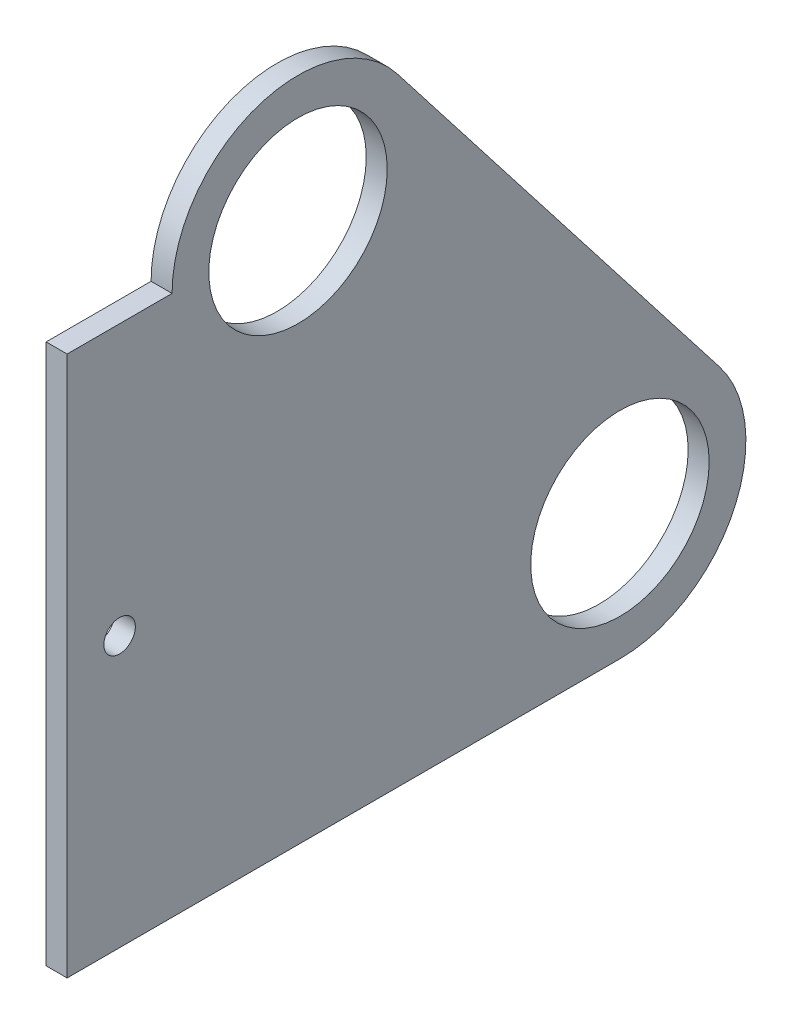
ISO-10303-21;
HEADER;
FILE_DESCRIPTION(('STEP AP214'),'2;1');
FILE_NAME('part.step','',(''),(''),'','','');
FILE_SCHEMA(('AUTOMOTIVE_DESIGN { 1 0 10303 214 1 1 1 1 }'));
ENDSEC;
DATA;
#1=APPLICATION_CONTEXT('core data for automotive mechanical design processes');
#2=APPLICATION_PROTOCOL_DEFINITION('international standard','automotive_design',2000,#1);
#3=PRODUCT_CONTEXT('',#1,'mechanical');
#4=PRODUCT('Part','Part','',(#3));
#5=PRODUCT_RELATED_PRODUCT_CATEGORY('part','',(#4));
#6=PRODUCT_DEFINITION_FORMATION('','',#4);
#7=PRODUCT_DEFINITION_CONTEXT('part definition',#1,'design');
#8=PRODUCT_DEFINITION('design','',#6,#7);
#9=PRODUCT_DEFINITION_SHAPE('','',#8);
#10=(LENGTH_UNIT() NAMED_UNIT(*) SI_UNIT(.MILLI.,.METRE.));
#11=(NAMED_UNIT(*) PLANE_ANGLE_UNIT() SI_UNIT($,.RADIAN.));
#12=(NAMED_UNIT(*) SI_UNIT($,.STERADIAN.) SOLID_ANGLE_UNIT());
#13=UNCERTAINTY_MEASURE_WITH_UNIT(LENGTH_MEASURE(1.E-05),#10,'distance_accuracy_value','');
#14=(GEOMETRIC_REPRESENTATION_CONTEXT(3) GLOBAL_UNCERTAINTY_ASSIGNED_CONTEXT((#13)) GLOBAL_UNIT_ASSIGNED_CONTEXT((#10,
#11,#12)) REPRESENTATION_CONTEXT('',''));
#15=CARTESIAN_POINT('',(0.,0.,0.));
#16=DIRECTION('',(0.,0.,1.));
#17=DIRECTION('',(1.,0.,0.));
#18=AXIS2_PLACEMENT_3D('',#15,#16,#17);
#19=CARTESIAN_POINT('',(2.,0.,0.));
#20=DIRECTION('',(-1.,0.,0.));
#21=DIRECTION('',(0.,0.,1.));
#22=AXIS2_PLACEMENT_3D('',#19,#20,#21);
#23=CYLINDRICAL_SURFACE('',#22,12.);
#24=CARTESIAN_POINT('',(0.,0.,0.));
#25=DIRECTION('',(1.,0.,0.));
#26=DIRECTION('',(0.,0.,-1.));
#27=AXIS2_PLACEMENT_3D('',#24,#25,#26);
#28=CIRCLE('',#27,12.);
#29=CARTESIAN_POINT('',(0.,7.36150243810954,-9.47672316012804));
#30=VERTEX_POINT('',#29);
#31=CARTESIAN_POINT('',(0.,-12.,0.));
#32=VERTEX_POINT('',#31);
#33=EDGE_CURVE('E127',#30,#32,#28,.F.);
#34=ORIENTED_EDGE('',*,*,#33,.F.);
#35=DIRECTION('',(-1.,0.,0.));
#36=VECTOR('',#35,1.);
#37=CARTESIAN_POINT('',(2.,7.36150243810954,-9.47672316012804));
#38=LINE('',#37,#36);
#39=CARTESIAN_POINT('',(2.,7.36150243810954,-9.47672316012804));
#40=VERTEX_POINT('',#39);
#41=EDGE_CURVE('E11',#40,#30,#38,.T.);
#42=ORIENTED_EDGE('',*,*,#41,.F.);
#43=CARTESIAN_POINT('',(2.,0.,0.));
#44=DIRECTION('',(1.,0.,0.));
#45=DIRECTION('',(0.,0.,-1.));
#46=AXIS2_PLACEMENT_3D('',#43,#44,#45);
#47=CIRCLE('',#46,12.);
#48=CARTESIAN_POINT('',(2.,-12.,0.));
#49=VERTEX_POINT('',#48);
#50=EDGE_CURVE('E146',#40,#49,#47,.F.);
#51=ORIENTED_EDGE('',*,*,#50,.T.);
#52=DIRECTION('',(-1.,0.,0.));
#53=VECTOR('',#52,1.);
#54=CARTESIAN_POINT('',(2.,-12.,0.));
#55=LINE('',#54,#53);
#56=EDGE_CURVE('E85',#49,#32,#55,.T.);
#57=ORIENTED_EDGE('',*,*,#56,.T.);
#58=EDGE_LOOP('',(#34,#42,#51,#57));
#59=FACE_BOUND('',#58,.T.);
#60=ADVANCED_FACE('F39',(#59),#23,.T.);
#61=CARTESIAN_POINT('',(2.,7.36150243810954,-9.47672316012804));
#62=DIRECTION('',(0.,0.613458536509128,-0.78972693001067));
#63=DIRECTION('',(0.,0.78972693001067,0.613458536509128));
#64=AXIS2_PLACEMENT_3D('',#61,#62,#63);
#65=PLANE('',#64);
#66=DIRECTION('',(0.,-0.78972693001067,-0.613458536509128));
#67=VECTOR('',#66,1.);
#68=CARTESIAN_POINT('',(0.,7.36150243810954,-9.47672316012804));
#69=LINE('',#68,#67);
#70=CARTESIAN_POINT('',(0.,46.8478489386431,21.1962036653284));
#71=VERTEX_POINT('',#70);
#72=EDGE_CURVE('E130',#71,#30,#69,.T.);
#73=ORIENTED_EDGE('',*,*,#72,.F.);
#74=DIRECTION('',(-1.,0.,0.));
#75=VECTOR('',#74,1.);
#76=CARTESIAN_POINT('',(2.,46.8478489386431,21.1962036653284));
#77=LINE('',#76,#75);
#78=CARTESIAN_POINT('',(2.,46.8478489386431,21.1962036653284));
#79=VERTEX_POINT('',#78);
#80=EDGE_CURVE('E48',#79,#71,#77,.T.);
#81=ORIENTED_EDGE('',*,*,#80,.F.);
#82=DIRECTION('',(0.,-0.78972693001067,-0.613458536509128));
#83=VECTOR('',#82,1.);
#84=CARTESIAN_POINT('',(2.,7.36150243810954,-9.47672316012804));
#85=LINE('',#84,#83);
#86=EDGE_CURVE('E163',#79,#40,#85,.T.);
#87=ORIENTED_EDGE('',*,*,#86,.T.);
#88=ORIENTED_EDGE('',*,*,#41,.T.);
#89=EDGE_LOOP('',(#73,#81,#87,#88));
#90=FACE_BOUND('',#89,.T.);
#91=ADVANCED_FACE('F156',(#90),#65,.T.);
#92=CARTESIAN_POINT('',(2.,39.4863465005335,30.6729268254564));
#93=DIRECTION('',(-1.,0.,0.));
#94=DIRECTION('',(0.,0.,1.));
#95=AXIS2_PLACEMENT_3D('',#92,#93,#94);
#96=CYLINDRICAL_SURFACE('',#95,12.);
#97=CARTESIAN_POINT('',(0.,39.4863465005335,30.6729268254564));
#98=DIRECTION('',(1.,0.,0.));
#99=DIRECTION('',(0.,0.,-1.));
#100=AXIS2_PLACEMENT_3D('',#97,#98,#99);
#101=CIRCLE('',#100,12.);
#102=CARTESIAN_POINT('',(0.,39.4863465005335,42.6729268254564));
#103=VERTEX_POINT('',#102);
#104=EDGE_CURVE('E133',#103,#71,#101,.F.);
#105=ORIENTED_EDGE('',*,*,#104,.F.);
#106=DIRECTION('',(-1.,0.,0.));
#107=VECTOR('',#106,1.);
#108=CARTESIAN_POINT('',(2.,39.4863465005335,42.6729268254564));
#109=LINE('',#108,#107);
#110=CARTESIAN_POINT('',(2.,39.4863465005335,42.6729268254564));
#111=VERTEX_POINT('',#110);
#112=EDGE_CURVE('E113',#111,#103,#109,.T.);
#113=ORIENTED_EDGE('',*,*,#112,.F.);
#114=CARTESIAN_POINT('',(2.,39.4863465005335,30.6729268254564));
#115=DIRECTION('',(1.,0.,0.));
#116=DIRECTION('',(0.,0.,-1.));
#117=AXIS2_PLACEMENT_3D('',#114,#115,#116);
#118=CIRCLE('',#117,12.);
#119=EDGE_CURVE('E106',#111,#79,#118,.F.);
#120=ORIENTED_EDGE('',*,*,#119,.T.);
#121=ORIENTED_EDGE('',*,*,#80,.T.);
#122=EDGE_LOOP('',(#105,#113,#120,#121));
#123=FACE_BOUND('',#122,.T.);
#124=ADVANCED_FACE('F153',(#123),#96,.T.);
#125=CARTESIAN_POINT('',(2.,39.4863465005335,0.));
#126=DIRECTION('',(0.,-1.,0.));
#127=DIRECTION('',(0.,0.,-1.));
#128=AXIS2_PLACEMENT_3D('',#125,#126,#127);
#129=PLANE('',#128);
#130=DIRECTION('',(0.,0.,1.));
#131=VECTOR('',#130,1.);
#132=CARTESIAN_POINT('',(0.,39.4863465005335,0.));
#133=LINE('',#132,#131);
#134=CARTESIAN_POINT('',(0.,39.4863465005335,52.6729268254564));
#135=VERTEX_POINT('',#134);
#136=EDGE_CURVE('E112',#103,#135,#133,.T.);
#137=ORIENTED_EDGE('',*,*,#136,.T.);
#138=DIRECTION('',(-1.,0.,0.));
#139=VECTOR('',#138,1.);
#140=CARTESIAN_POINT('',(2.,39.4863465005335,52.6729268254564));
#141=LINE('',#140,#139);
#142=CARTESIAN_POINT('',(2.,39.4863465005335,52.6729268254564));
#143=VERTEX_POINT('',#142);
#144=EDGE_CURVE('E109',#143,#135,#141,.T.);
#145=ORIENTED_EDGE('',*,*,#144,.F.);
#146=DIRECTION('',(0.,0.,1.));
#147=VECTOR('',#146,1.);
#148=CARTESIAN_POINT('',(2.,39.4863465005335,0.));
#149=LINE('',#148,#147);
#150=EDGE_CURVE('E98',#111,#143,#149,.T.);
#151=ORIENTED_EDGE('',*,*,#150,.F.);
#152=ORIENTED_EDGE('',*,*,#112,.T.);
#153=EDGE_LOOP('',(#137,#145,#151,#152));
#154=FACE_BOUND('',#153,.T.);
#155=ADVANCED_FACE('F110',(#154),#129,.F.);
#156=CARTESIAN_POINT('',(2.,0.,52.6729268254564));
#157=DIRECTION('',(0.,0.,-1.));
#158=DIRECTION('',(0.,1.,0.));
#159=AXIS2_PLACEMENT_3D('',#156,#157,#158);
#160=PLANE('',#159);
#161=DIRECTION('',(0.,-1.,0.));
#162=VECTOR('',#161,1.);
#163=CARTESIAN_POINT('',(0.,0.,52.6729268254564));
#164=LINE('',#163,#162);
#165=CARTESIAN_POINT('',(0.,-12.,52.6729268254564));
#166=VERTEX_POINT('',#165);
#167=EDGE_CURVE('E78',#135,#166,#164,.T.);
#168=ORIENTED_EDGE('',*,*,#167,.T.);
#169=DIRECTION('',(-1.,0.,0.));
#170=VECTOR('',#169,1.);
#171=CARTESIAN_POINT('',(2.,-12.,52.6729268254564));
#172=LINE('',#171,#170);
#173=CARTESIAN_POINT('',(2.,-12.,52.6729268254564));
#174=VERTEX_POINT('',#173);
#175=EDGE_CURVE('E114',#174,#166,#172,.T.);
#176=ORIENTED_EDGE('',*,*,#175,.F.);
#177=DIRECTION('',(0.,-1.,0.));
#178=VECTOR('',#177,1.);
#179=CARTESIAN_POINT('',(2.,0.,52.6729268254564));
#180=LINE('',#179,#178);
#181=EDGE_CURVE('E103',#143,#174,#180,.T.);
#182=ORIENTED_EDGE('',*,*,#181,.F.);
#183=ORIENTED_EDGE('',*,*,#144,.T.);
#184=EDGE_LOOP('',(#168,#176,#182,#183));
#185=FACE_BOUND('',#184,.T.);
#186=ADVANCED_FACE('F116',(#185),#160,.F.);
#187=CARTESIAN_POINT('',(2.,39.4863465005335,30.6729268254564));
#188=DIRECTION('',(-1.,0.,0.));
#189=DIRECTION('',(0.,0.,1.));
#190=AXIS2_PLACEMENT_3D('',#187,#188,#189);
#191=CYLINDRICAL_SURFACE('',#190,8.5);
#192=CARTESIAN_POINT('',(2.,39.4863465005335,30.6729268254564));
#193=DIRECTION('',(1.,0.,0.));
#194=DIRECTION('',(0.,0.,-1.));
#195=AXIS2_PLACEMENT_3D('',#192,#193,#194);
#196=CIRCLE('',#195,8.5);
#197=CARTESIAN_POINT('',(2.,39.4863465005335,22.1729268254564));
#198=VERTEX_POINT('',#197);
#199=EDGE_CURVE('E118',#198,#198,#196,.T.);
#200=ORIENTED_EDGE('',*,*,#199,.T.);
#201=EDGE_LOOP('',(#200));
#202=FACE_BOUND('',#201,.T.);
#203=CARTESIAN_POINT('',(0.,39.4863465005335,30.6729268254564));
#204=DIRECTION('',(1.,0.,0.));
#205=DIRECTION('',(0.,0.,-1.));
#206=AXIS2_PLACEMENT_3D('',#203,#204,#205);
#207=CIRCLE('',#206,8.5);
#208=CARTESIAN_POINT('',(0.,39.4863465005335,22.1729268254564));
#209=VERTEX_POINT('',#208);
#210=EDGE_CURVE('E140',#209,#209,#207,.T.);
#211=ORIENTED_EDGE('',*,*,#210,.F.);
#212=EDGE_LOOP('',(#211));
#213=FACE_BOUND('',#212,.T.);
#214=ADVANCED_FACE('F197',(#202,#213),#191,.F.);
#215=CARTESIAN_POINT('',(2.,-12.,0.));
#216=DIRECTION('',(0.,1.,0.));
#217=DIRECTION('',(0.,0.,1.));
#218=AXIS2_PLACEMENT_3D('',#215,#216,#217);
#219=PLANE('',#218);
#220=DIRECTION('',(0.,0.,-1.));
#221=VECTOR('',#220,1.);
#222=CARTESIAN_POINT('',(0.,-12.,0.));
#223=LINE('',#222,#221);
#224=EDGE_CURVE('E138',#166,#32,#223,.T.);
#225=ORIENTED_EDGE('',*,*,#224,.T.);
#226=ORIENTED_EDGE('',*,*,#56,.F.);
#227=DIRECTION('',(0.,0.,-1.));
#228=VECTOR('',#227,1.);
#229=CARTESIAN_POINT('',(2.,-12.,0.));
#230=LINE('',#229,#228);
#231=EDGE_CURVE('E56',#174,#49,#230,.T.);
#232=ORIENTED_EDGE('',*,*,#231,.F.);
#233=ORIENTED_EDGE('',*,*,#175,.T.);
#234=EDGE_LOOP('',(#225,#226,#232,#233));
#235=FACE_BOUND('',#234,.T.);
#236=ADVANCED_FACE('F162',(#235),#219,.F.);
#237=CARTESIAN_POINT('',(2.,0.,0.));
#238=DIRECTION('',(-1.,0.,0.));
#239=DIRECTION('',(0.,0.,1.));
#240=AXIS2_PLACEMENT_3D('',#237,#238,#239);
#241=CYLINDRICAL_SURFACE('',#240,8.5);
#242=CARTESIAN_POINT('',(2.,0.,0.));
#243=DIRECTION('',(1.,0.,0.));
#244=DIRECTION('',(0.,0.,-1.));
#245=AXIS2_PLACEMENT_3D('',#242,#243,#244);
#246=CIRCLE('',#245,8.5);
#247=CARTESIAN_POINT('',(2.,0.,-8.5));
#248=VERTEX_POINT('',#247);
#249=EDGE_CURVE('E124',#248,#248,#246,.T.);
#250=ORIENTED_EDGE('',*,*,#249,.T.);
#251=EDGE_LOOP('',(#250));
#252=FACE_BOUND('',#251,.T.);
#253=CARTESIAN_POINT('',(0.,0.,0.));
#254=DIRECTION('',(1.,0.,0.));
#255=DIRECTION('',(0.,0.,-1.));
#256=AXIS2_PLACEMENT_3D('',#253,#254,#255);
#257=CIRCLE('',#256,8.5);
#258=CARTESIAN_POINT('',(0.,0.,-8.5));
#259=VERTEX_POINT('',#258);
#260=EDGE_CURVE('E143',#259,#259,#257,.T.);
#261=ORIENTED_EDGE('',*,*,#260,.F.);
#262=EDGE_LOOP('',(#261));
#263=FACE_BOUND('',#262,.T.);
#264=ADVANCED_FACE('F200',(#252,#263),#241,.F.);
#265=CARTESIAN_POINT('',(2.,0.,0.));
#266=DIRECTION('',(1.,0.,0.));
#267=DIRECTION('',(0.,0.,-1.));
#268=AXIS2_PLACEMENT_3D('',#265,#266,#267);
#269=PLANE('',#268);
#270=CARTESIAN_POINT('',(2.,13.7431732502668,47.6729268254564));
#271=DIRECTION('',(1.,0.,0.));
#272=DIRECTION('',(0.,0.,-1.));
#273=AXIS2_PLACEMENT_3D('',#270,#271,#272);
#274=CIRCLE('',#273,1.5);
#275=CARTESIAN_POINT('',(2.,13.7431732502668,46.1729268254564));
#276=VERTEX_POINT('',#275);
#277=EDGE_CURVE('E167',#276,#276,#274,.T.);
#278=ORIENTED_EDGE('',*,*,#277,.F.);
#279=EDGE_LOOP('',(#278));
#280=FACE_BOUND('',#279,.T.);
#281=ORIENTED_EDGE('',*,*,#50,.F.);
#282=ORIENTED_EDGE('',*,*,#86,.F.);
#283=ORIENTED_EDGE('',*,*,#119,.F.);
#284=ORIENTED_EDGE('',*,*,#150,.T.);
#285=ORIENTED_EDGE('',*,*,#181,.T.);
#286=ORIENTED_EDGE('',*,*,#231,.T.);
#287=EDGE_LOOP('',(#281,#282,#283,#284,#285,#286));
#288=FACE_BOUND('',#287,.T.);
#289=ORIENTED_EDGE('',*,*,#199,.F.);
#290=EDGE_LOOP('',(#289));
#291=FACE_BOUND('',#290,.T.);
#292=ORIENTED_EDGE('',*,*,#249,.F.);
#293=EDGE_LOOP('',(#292));
#294=FACE_BOUND('',#293,.T.);
#295=ADVANCED_FACE('F100',(#280,#288,#291,#294),#269,.T.);
#296=CARTESIAN_POINT('',(0.,0.,0.));
#297=DIRECTION('',(1.,0.,0.));
#298=DIRECTION('',(0.,0.,-1.));
#299=AXIS2_PLACEMENT_3D('',#296,#297,#298);
#300=PLANE('',#299);
#301=CARTESIAN_POINT('',(0.,13.7431732502668,47.6729268254564));
#302=DIRECTION('',(1.,0.,0.));
#303=DIRECTION('',(0.,0.,-1.));
#304=AXIS2_PLACEMENT_3D('',#301,#302,#303);
#305=CIRCLE('',#304,1.5);
#306=CARTESIAN_POINT('',(0.,13.7431732502668,46.1729268254564));
#307=VERTEX_POINT('',#306);
#308=EDGE_CURVE('E42',#307,#307,#305,.T.);
#309=ORIENTED_EDGE('',*,*,#308,.T.);
#310=EDGE_LOOP('',(#309));
#311=FACE_BOUND('',#310,.T.);
#312=ORIENTED_EDGE('',*,*,#33,.T.);
#313=ORIENTED_EDGE('',*,*,#224,.F.);
#314=ORIENTED_EDGE('',*,*,#167,.F.);
#315=ORIENTED_EDGE('',*,*,#136,.F.);
#316=ORIENTED_EDGE('',*,*,#104,.T.);
#317=ORIENTED_EDGE('',*,*,#72,.T.);
#318=EDGE_LOOP('',(#312,#313,#314,#315,#316,#317));
#319=FACE_BOUND('',#318,.T.);
#320=ORIENTED_EDGE('',*,*,#210,.T.);
#321=EDGE_LOOP('',(#320));
#322=FACE_BOUND('',#321,.T.);
#323=ORIENTED_EDGE('',*,*,#260,.T.);
#324=EDGE_LOOP('',(#323));
#325=FACE_BOUND('',#324,.T.);
#326=ADVANCED_FACE('F158',(#311,#319,#322,#325),#300,.F.);
#327=CARTESIAN_POINT('',(-8.,13.7431732502668,47.6729268254564));
#328=DIRECTION('',(1.,0.,0.));
#329=DIRECTION('',(0.,0.,-1.));
#330=AXIS2_PLACEMENT_3D('',#327,#328,#329);
#331=CYLINDRICAL_SURFACE('',#330,1.5);
#332=ORIENTED_EDGE('',*,*,#277,.T.);
#333=EDGE_LOOP('',(#332));
#334=FACE_BOUND('',#333,.T.);
#335=ORIENTED_EDGE('',*,*,#308,.F.);
#336=EDGE_LOOP('',(#335));
#337=FACE_BOUND('',#336,.T.);
#338=ADVANCED_FACE('F175',(#334,#337),#331,.F.);
#339=CLOSED_SHELL('',(#60,#91,#124,#155,#186,#214,#236,#264,#295,#326,#338));
#340=MANIFOLD_SOLID_BREP('B2',#339);
#341=ADVANCED_BREP_SHAPE_REPRESENTATION('',(#18,#340),#14);
#342=SHAPE_DEFINITION_REPRESENTATION(#9,#341);
ENDSEC;
END-ISO-10303-21;
